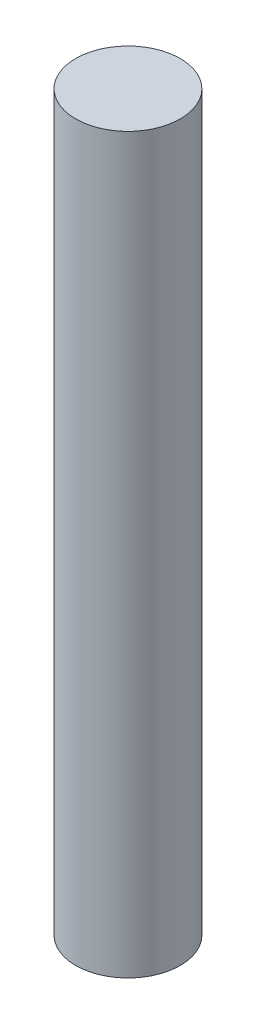
ISO-10303-21;
HEADER;
FILE_DESCRIPTION(('STEP AP214'),'2;1');
FILE_NAME('part.step','',(''),(''),'','','');
FILE_SCHEMA(('AUTOMOTIVE_DESIGN { 1 0 10303 214 1 1 1 1 }'));
ENDSEC;
DATA;
#1=APPLICATION_CONTEXT('core data for automotive mechanical design processes');
#2=APPLICATION_PROTOCOL_DEFINITION('international standard','automotive_design',2000,#1);
#3=PRODUCT_CONTEXT('',#1,'mechanical');
#4=PRODUCT('Part','Part','',(#3));
#5=PRODUCT_RELATED_PRODUCT_CATEGORY('part','',(#4));
#6=PRODUCT_DEFINITION_FORMATION('','',#4);
#7=PRODUCT_DEFINITION_CONTEXT('part definition',#1,'design');
#8=PRODUCT_DEFINITION('design','',#6,#7);
#9=PRODUCT_DEFINITION_SHAPE('','',#8);
#10=(LENGTH_UNIT() NAMED_UNIT(*) SI_UNIT(.MILLI.,.METRE.));
#11=(NAMED_UNIT(*) PLANE_ANGLE_UNIT() SI_UNIT($,.RADIAN.));
#12=(NAMED_UNIT(*) SI_UNIT($,.STERADIAN.) SOLID_ANGLE_UNIT());
#13=UNCERTAINTY_MEASURE_WITH_UNIT(LENGTH_MEASURE(1.E-05),#10,'distance_accuracy_value','');
#14=(GEOMETRIC_REPRESENTATION_CONTEXT(3) GLOBAL_UNCERTAINTY_ASSIGNED_CONTEXT((#13)) GLOBAL_UNIT_ASSIGNED_CONTEXT((#10,
#11,#12)) REPRESENTATION_CONTEXT('',''));
#15=CARTESIAN_POINT('',(0.,0.,0.));
#16=DIRECTION('',(0.,0.,1.));
#17=DIRECTION('',(1.,0.,0.));
#18=AXIS2_PLACEMENT_3D('',#15,#16,#17);
#19=CARTESIAN_POINT('',(0.,34.,0.));
#20=DIRECTION('',(0.,-1.,0.));
#21=DIRECTION('',(0.,0.,-1.));
#22=AXIS2_PLACEMENT_3D('',#19,#20,#21);
#23=CYLINDRICAL_SURFACE('',#22,4.85);
#24=CARTESIAN_POINT('',(0.,34.,0.));
#25=DIRECTION('',(0.,1.,0.));
#26=DIRECTION('',(0.,0.,1.));
#27=AXIS2_PLACEMENT_3D('',#24,#25,#26);
#28=CIRCLE('',#27,4.85);
#29=CARTESIAN_POINT('',(0.,34.,4.85));
#30=VERTEX_POINT('',#29);
#31=EDGE_CURVE('E10',#30,#30,#28,.T.);
#32=ORIENTED_EDGE('',*,*,#31,.F.);
#33=EDGE_LOOP('',(#32));
#34=FACE_BOUND('',#33,.T.);
#35=CARTESIAN_POINT('',(0.,-34.,0.));
#36=DIRECTION('',(0.,1.,0.));
#37=DIRECTION('',(0.,0.,1.));
#38=AXIS2_PLACEMENT_3D('',#35,#36,#37);
#39=CIRCLE('',#38,4.85);
#40=CARTESIAN_POINT('',(0.,-34.,4.85));
#41=VERTEX_POINT('',#40);
#42=EDGE_CURVE('E44',#41,#41,#39,.T.);
#43=ORIENTED_EDGE('',*,*,#42,.T.);
#44=EDGE_LOOP('',(#43));
#45=FACE_BOUND('',#44,.T.);
#46=ADVANCED_FACE('F41',(#34,#45),#23,.T.);
#47=CARTESIAN_POINT('',(0.,34.,0.));
#48=DIRECTION('',(0.,1.,0.));
#49=DIRECTION('',(0.,0.,1.));
#50=AXIS2_PLACEMENT_3D('',#47,#48,#49);
#51=PLANE('',#50);
#52=ORIENTED_EDGE('',*,*,#31,.T.);
#53=EDGE_LOOP('',(#52));
#54=FACE_BOUND('',#53,.T.);
#55=ADVANCED_FACE('F58',(#54),#51,.T.);
#56=CARTESIAN_POINT('',(0.,-34.,0.));
#57=DIRECTION('',(0.,1.,0.));
#58=DIRECTION('',(0.,0.,1.));
#59=AXIS2_PLACEMENT_3D('',#56,#57,#58);
#60=PLANE('',#59);
#61=ORIENTED_EDGE('',*,*,#42,.F.);
#62=EDGE_LOOP('',(#61));
#63=FACE_BOUND('',#62,.T.);
#64=ADVANCED_FACE('F56',(#63),#60,.F.);
#65=CLOSED_SHELL('',(#46,#55,#64));
#66=MANIFOLD_SOLID_BREP('B2',#65);
#67=ADVANCED_BREP_SHAPE_REPRESENTATION('',(#18,#66),#14);
#68=SHAPE_DEFINITION_REPRESENTATION(#9,#67);
ENDSEC;
END-ISO-10303-21;
